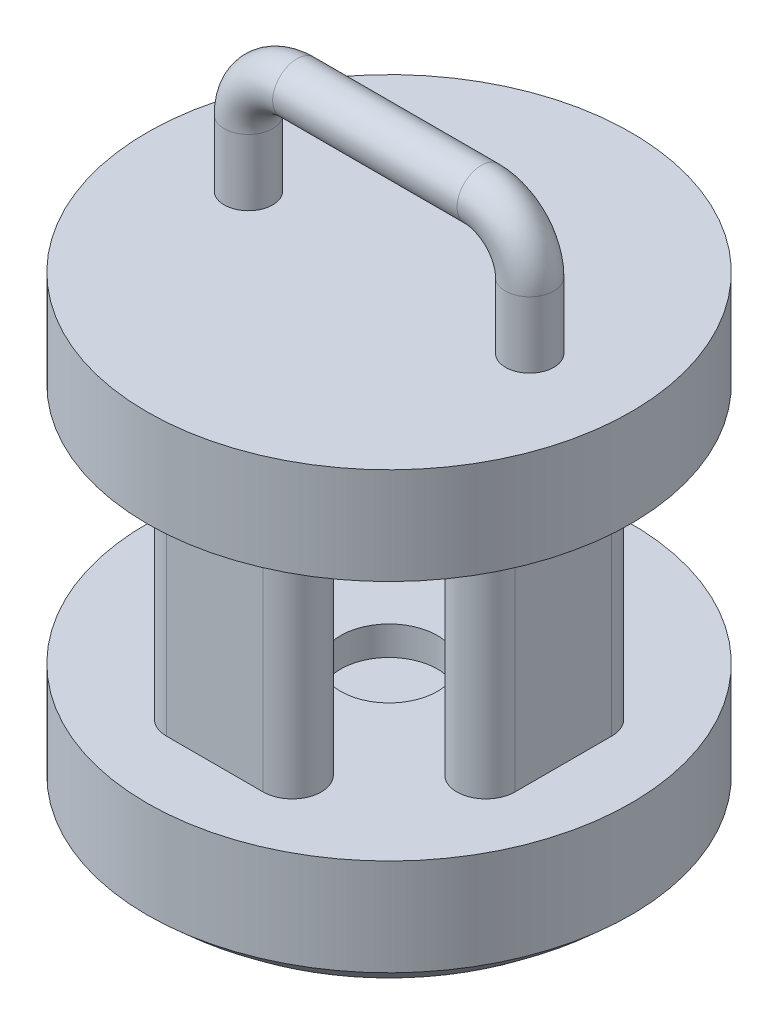
ISO-10303-21;
HEADER;
FILE_DESCRIPTION(('STEP AP214'),'2;1');
FILE_NAME('part.step','',(''),(''),'','','');
FILE_SCHEMA(('AUTOMOTIVE_DESIGN { 1 0 10303 214 1 1 1 1 }'));
ENDSEC;
DATA;
#1=APPLICATION_CONTEXT('core data for automotive mechanical design processes');
#2=APPLICATION_PROTOCOL_DEFINITION('international standard','automotive_design',2000,#1);
#3=PRODUCT_CONTEXT('',#1,'mechanical');
#4=PRODUCT('Part','Part','',(#3));
#5=PRODUCT_RELATED_PRODUCT_CATEGORY('part','',(#4));
#6=PRODUCT_DEFINITION_FORMATION('','',#4);
#7=PRODUCT_DEFINITION_CONTEXT('part definition',#1,'design');
#8=PRODUCT_DEFINITION('design','',#6,#7);
#9=PRODUCT_DEFINITION_SHAPE('','',#8);
#10=(LENGTH_UNIT() NAMED_UNIT(*) SI_UNIT(.MILLI.,.METRE.));
#11=(NAMED_UNIT(*) PLANE_ANGLE_UNIT() SI_UNIT($,.RADIAN.));
#12=(NAMED_UNIT(*) SI_UNIT($,.STERADIAN.) SOLID_ANGLE_UNIT());
#13=UNCERTAINTY_MEASURE_WITH_UNIT(LENGTH_MEASURE(1.E-05),#10,'distance_accuracy_value','');
#14=(GEOMETRIC_REPRESENTATION_CONTEXT(3) GLOBAL_UNCERTAINTY_ASSIGNED_CONTEXT((#13)) GLOBAL_UNIT_ASSIGNED_CONTEXT((#10,
#11,#12)) REPRESENTATION_CONTEXT('',''));
#15=CARTESIAN_POINT('',(0.,0.,0.));
#16=DIRECTION('',(0.,0.,1.));
#17=DIRECTION('',(1.,0.,0.));
#18=AXIS2_PLACEMENT_3D('',#15,#16,#17);
#19=CARTESIAN_POINT('',(0.,11.43,0.));
#20=DIRECTION('',(0.,1.,0.));
#21=DIRECTION('',(0.,0.,1.));
#22=AXIS2_PLACEMENT_3D('',#19,#20,#21);
#23=PLANE('',#22);
#24=CARTESIAN_POINT('',(-3.68967686671968,11.43,0.));
#25=DIRECTION('',(0.,1.,0.));
#26=DIRECTION('',(0.,0.,1.));
#27=AXIS2_PLACEMENT_3D('',#24,#25,#26);
#28=CIRCLE('',#27,0.635);
#29=CARTESIAN_POINT('',(-3.68967686671968,11.43,0.635));
#30=VERTEX_POINT('',#29);
#31=EDGE_CURVE('E11',#30,#30,#28,.T.);
#32=ORIENTED_EDGE('',*,*,#31,.F.);
#33=EDGE_LOOP('',(#32));
#34=FACE_BOUND('',#33,.T.);
#35=CARTESIAN_POINT('',(0.,11.43,0.));
#36=DIRECTION('',(0.,1.,0.));
#37=DIRECTION('',(0.,0.,1.));
#38=AXIS2_PLACEMENT_3D('',#35,#36,#37);
#39=CIRCLE('',#38,6.35);
#40=CARTESIAN_POINT('',(0.,11.43,6.35));
#41=VERTEX_POINT('',#40);
#42=EDGE_CURVE('E178',#41,#41,#39,.T.);
#43=ORIENTED_EDGE('',*,*,#42,.T.);
#44=EDGE_LOOP('',(#43));
#45=FACE_BOUND('',#44,.T.);
#46=CARTESIAN_POINT('',(3.68967686671968,11.43,0.));
#47=DIRECTION('',(0.,-1.,0.));
#48=DIRECTION('',(0.,0.,1.));
#49=AXIS2_PLACEMENT_3D('',#46,#47,#48);
#50=CIRCLE('',#49,0.635);
#51=CARTESIAN_POINT('',(3.68967686671968,11.43,0.635));
#52=VERTEX_POINT('',#51);
#53=EDGE_CURVE('E397',#52,#52,#50,.T.);
#54=ORIENTED_EDGE('',*,*,#53,.T.);
#55=EDGE_LOOP('',(#54));
#56=FACE_BOUND('',#55,.T.);
#57=ADVANCED_FACE('F33',(#34,#45,#56),#23,.T.);
#58=CARTESIAN_POINT('',(0.,2.54,0.));
#59=DIRECTION('',(0.,1.,0.));
#60=DIRECTION('',(0.,0.,1.));
#61=AXIS2_PLACEMENT_3D('',#58,#59,#60);
#62=PLANE('',#61);
#63=CARTESIAN_POINT('',(0.,2.54,0.));
#64=DIRECTION('',(0.,1.,0.));
#65=DIRECTION('',(0.,0.,1.));
#66=AXIS2_PLACEMENT_3D('',#63,#64,#65);
#67=CIRCLE('',#66,1.27);
#68=CARTESIAN_POINT('',(0.,2.54,1.27));
#69=VERTEX_POINT('',#68);
#70=EDGE_CURVE('E415',#69,#69,#67,.T.);
#71=ORIENTED_EDGE('',*,*,#70,.F.);
#72=EDGE_LOOP('',(#71));
#73=FACE_BOUND('',#72,.T.);
#74=DIRECTION('',(-1.,0.,0.));
#75=VECTOR('',#74,1.);
#76=CARTESIAN_POINT('',(1.27,2.54,-4.572));
#77=LINE('',#76,#75);
#78=CARTESIAN_POINT('',(1.27,2.54,-4.572));
#79=VERTEX_POINT('',#78);
#80=CARTESIAN_POINT('',(-1.27,2.54,-4.572));
#81=VERTEX_POINT('',#80);
#82=EDGE_CURVE('E205',#79,#81,#77,.T.);
#83=ORIENTED_EDGE('',*,*,#82,.F.);
#84=CARTESIAN_POINT('',(1.27,2.54,-3.81));
#85=DIRECTION('',(0.,1.,0.));
#86=DIRECTION('',(0.,0.,-1.));
#87=AXIS2_PLACEMENT_3D('',#84,#85,#86);
#88=CIRCLE('',#87,0.762);
#89=CARTESIAN_POINT('',(1.27,2.54,-3.048));
#90=VERTEX_POINT('',#89);
#91=EDGE_CURVE('E188',#90,#79,#88,.T.);
#92=ORIENTED_EDGE('',*,*,#91,.F.);
#93=DIRECTION('',(1.,0.,0.));
#94=VECTOR('',#93,1.);
#95=CARTESIAN_POINT('',(1.27,2.54,-3.048));
#96=LINE('',#95,#94);
#97=CARTESIAN_POINT('',(-1.27,2.54,-3.048));
#98=VERTEX_POINT('',#97);
#99=EDGE_CURVE('E193',#98,#90,#96,.T.);
#100=ORIENTED_EDGE('',*,*,#99,.F.);
#101=CARTESIAN_POINT('',(-1.27,2.54,-3.81));
#102=DIRECTION('',(0.,1.,0.));
#103=DIRECTION('',(0.,0.,-1.));
#104=AXIS2_PLACEMENT_3D('',#101,#102,#103);
#105=CIRCLE('',#104,0.762);
#106=EDGE_CURVE('E207',#81,#98,#105,.T.);
#107=ORIENTED_EDGE('',*,*,#106,.F.);
#108=EDGE_LOOP('',(#83,#92,#100,#107));
#109=FACE_BOUND('',#108,.T.);
#110=DIRECTION('',(1.,0.,0.));
#111=VECTOR('',#110,1.);
#112=CARTESIAN_POINT('',(-1.27,2.54,4.572));
#113=LINE('',#112,#111);
#114=CARTESIAN_POINT('',(-1.27,2.54,4.572));
#115=VERTEX_POINT('',#114);
#116=CARTESIAN_POINT('',(1.27,2.54,4.572));
#117=VERTEX_POINT('',#116);
#118=EDGE_CURVE('E267',#115,#117,#113,.T.);
#119=ORIENTED_EDGE('',*,*,#118,.F.);
#120=CARTESIAN_POINT('',(-1.27,2.54,3.81));
#121=DIRECTION('',(0.,1.,0.));
#122=DIRECTION('',(0.,0.,1.));
#123=AXIS2_PLACEMENT_3D('',#120,#121,#122);
#124=CIRCLE('',#123,0.762);
#125=CARTESIAN_POINT('',(-1.27,2.54,3.048));
#126=VERTEX_POINT('',#125);
#127=EDGE_CURVE('E250',#126,#115,#124,.T.);
#128=ORIENTED_EDGE('',*,*,#127,.F.);
#129=DIRECTION('',(-1.,0.,0.));
#130=VECTOR('',#129,1.);
#131=CARTESIAN_POINT('',(-1.27,2.54,3.048));
#132=LINE('',#131,#130);
#133=CARTESIAN_POINT('',(1.27,2.54,3.048));
#134=VERTEX_POINT('',#133);
#135=EDGE_CURVE('E255',#134,#126,#132,.T.);
#136=ORIENTED_EDGE('',*,*,#135,.F.);
#137=CARTESIAN_POINT('',(1.27,2.54,3.81));
#138=DIRECTION('',(0.,1.,0.));
#139=DIRECTION('',(0.,0.,1.));
#140=AXIS2_PLACEMENT_3D('',#137,#138,#139);
#141=CIRCLE('',#140,0.762);
#142=EDGE_CURVE('E269',#117,#134,#141,.T.);
#143=ORIENTED_EDGE('',*,*,#142,.F.);
#144=EDGE_LOOP('',(#119,#128,#136,#143));
#145=FACE_BOUND('',#144,.T.);
#146=CARTESIAN_POINT('',(0.,2.54,0.));
#147=DIRECTION('',(0.,1.,0.));
#148=DIRECTION('',(0.,0.,1.));
#149=AXIS2_PLACEMENT_3D('',#146,#147,#148);
#150=CIRCLE('',#149,6.35);
#151=CARTESIAN_POINT('',(0.,2.54,6.35));
#152=VERTEX_POINT('',#151);
#153=EDGE_CURVE('E42',#152,#152,#150,.T.);
#154=ORIENTED_EDGE('',*,*,#153,.T.);
#155=EDGE_LOOP('',(#154));
#156=FACE_BOUND('',#155,.T.);
#157=DIRECTION('',(0.,0.,1.));
#158=VECTOR('',#157,1.);
#159=CARTESIAN_POINT('',(-4.572,2.54,-1.27000000000002));
#160=LINE('',#159,#158);
#161=CARTESIAN_POINT('',(-4.572,2.54,-1.27000000000002));
#162=VERTEX_POINT('',#161);
#163=CARTESIAN_POINT('',(-4.572,2.54,1.26999999999998));
#164=VERTEX_POINT('',#163);
#165=EDGE_CURVE('E235',#162,#164,#160,.T.);
#166=ORIENTED_EDGE('',*,*,#165,.F.);
#167=CARTESIAN_POINT('',(-3.81,2.54,-1.27000000000001));
#168=DIRECTION('',(0.,1.,0.));
#169=DIRECTION('',(-1.,0.,0.));
#170=AXIS2_PLACEMENT_3D('',#167,#168,#169);
#171=CIRCLE('',#170,0.762);
#172=CARTESIAN_POINT('',(-3.04799999999999,2.54,-1.27000000000001));
#173=VERTEX_POINT('',#172);
#174=EDGE_CURVE('E218',#173,#162,#171,.T.);
#175=ORIENTED_EDGE('',*,*,#174,.F.);
#176=DIRECTION('',(0.,0.,-1.));
#177=VECTOR('',#176,1.);
#178=CARTESIAN_POINT('',(-3.04799999999999,2.54,-1.27000000000001));
#179=LINE('',#178,#177);
#180=CARTESIAN_POINT('',(-3.048,2.54,1.26999999999999));
#181=VERTEX_POINT('',#180);
#182=EDGE_CURVE('E223',#181,#173,#179,.T.);
#183=ORIENTED_EDGE('',*,*,#182,.F.);
#184=CARTESIAN_POINT('',(-3.81,2.54,1.26999999999999));
#185=DIRECTION('',(0.,1.,0.));
#186=DIRECTION('',(-1.,0.,0.));
#187=AXIS2_PLACEMENT_3D('',#184,#185,#186);
#188=CIRCLE('',#187,0.762);
#189=EDGE_CURVE('E237',#164,#181,#188,.T.);
#190=ORIENTED_EDGE('',*,*,#189,.F.);
#191=EDGE_LOOP('',(#166,#175,#183,#190));
#192=FACE_BOUND('',#191,.T.);
#193=DIRECTION('',(0.,0.,-1.));
#194=VECTOR('',#193,1.);
#195=CARTESIAN_POINT('',(4.57199999999999,2.54,1.27000000000005));
#196=LINE('',#195,#194);
#197=CARTESIAN_POINT('',(4.57199999999999,2.54,1.27000000000005));
#198=VERTEX_POINT('',#197);
#199=CARTESIAN_POINT('',(4.57200000000001,2.54,-1.26999999999995));
#200=VERTEX_POINT('',#199);
#201=EDGE_CURVE('E177',#198,#200,#196,.T.);
#202=ORIENTED_EDGE('',*,*,#201,.F.);
#203=CARTESIAN_POINT('',(3.80999999999999,2.54,1.27000000000004));
#204=DIRECTION('',(0.,1.,0.));
#205=DIRECTION('',(1.,0.,0.));
#206=AXIS2_PLACEMENT_3D('',#203,#204,#205);
#207=CIRCLE('',#206,0.762);
#208=CARTESIAN_POINT('',(3.04799999999999,2.54,1.27000000000003));
#209=VERTEX_POINT('',#208);
#210=EDGE_CURVE('E175',#209,#198,#207,.T.);
#211=ORIENTED_EDGE('',*,*,#210,.F.);
#212=DIRECTION('',(0.,0.,1.));
#213=VECTOR('',#212,1.);
#214=CARTESIAN_POINT('',(3.04799999999999,2.54,1.27000000000003));
#215=LINE('',#214,#213);
#216=CARTESIAN_POINT('',(3.04800000000001,2.54,-1.26999999999997));
#217=VERTEX_POINT('',#216);
#218=EDGE_CURVE('E160',#217,#209,#215,.T.);
#219=ORIENTED_EDGE('',*,*,#218,.F.);
#220=CARTESIAN_POINT('',(3.81000000000001,2.54,-1.26999999999996));
#221=DIRECTION('',(0.,1.,0.));
#222=DIRECTION('',(1.,0.,0.));
#223=AXIS2_PLACEMENT_3D('',#220,#221,#222);
#224=CIRCLE('',#223,0.762);
#225=EDGE_CURVE('E180',#200,#217,#224,.T.);
#226=ORIENTED_EDGE('',*,*,#225,.F.);
#227=EDGE_LOOP('',(#202,#211,#219,#226));
#228=FACE_BOUND('',#227,.T.);
#229=ADVANCED_FACE('F298',(#73,#109,#145,#156,#192,#228),#62,.T.);
#230=CARTESIAN_POINT('',(0.,2.54,0.));
#231=DIRECTION('',(0.,-1.,0.));
#232=DIRECTION('',(0.,0.,-1.));
#233=AXIS2_PLACEMENT_3D('',#230,#231,#232);
#234=CYLINDRICAL_SURFACE('',#233,6.35);
#235=ORIENTED_EDGE('',*,*,#153,.F.);
#236=EDGE_LOOP('',(#235));
#237=FACE_BOUND('',#236,.T.);
#238=CARTESIAN_POINT('',(0.,0.,0.));
#239=DIRECTION('',(0.,1.,0.));
#240=DIRECTION('',(0.,0.,1.));
#241=AXIS2_PLACEMENT_3D('',#238,#239,#240);
#242=CIRCLE('',#241,6.35);
#243=CARTESIAN_POINT('',(0.,0.,6.35));
#244=VERTEX_POINT('',#243);
#245=EDGE_CURVE('E37',#244,#244,#242,.T.);
#246=ORIENTED_EDGE('',*,*,#245,.T.);
#247=EDGE_LOOP('',(#246));
#248=FACE_BOUND('',#247,.T.);
#249=ADVANCED_FACE('F287',(#237,#248),#234,.T.);
#250=CARTESIAN_POINT('',(0.,6.66749999999999,0.));
#251=DIRECTION('',(0.,0.,1.));
#252=DIRECTION('',(1.,0.,0.));
#253=AXIS2_PLACEMENT_3D('',#250,#251,#252);
#254=SPHERICAL_SURFACE('',#253,9.2075);
#255=CARTESIAN_POINT('',(0.,6.66749999999999,0.));
#256=DIRECTION('',(0.,1.,0.));
#257=DIRECTION('',(0.,0.,1.));
#258=AXIS2_PLACEMENT_3D('',#255,#256,#257);
#259=SPHERICAL_SURFACE('',#258,9.2075);
#260=ORIENTED_EDGE('',*,*,#245,.F.);
#261=EDGE_LOOP('',(#260));
#262=FACE_BOUND('',#261,.T.);
#263=ADVANCED_FACE('F35',(#262),#259,.T.);
#264=CARTESIAN_POINT('',(-1.27,8.89,3.81));
#265=DIRECTION('',(0.,-1.,0.));
#266=DIRECTION('',(0.,0.,-1.));
#267=AXIS2_PLACEMENT_3D('',#264,#265,#266);
#268=CYLINDRICAL_SURFACE('',#267,0.762);
#269=ORIENTED_EDGE('',*,*,#127,.T.);
#270=DIRECTION('',(0.,-1.,0.));
#271=VECTOR('',#270,1.);
#272=CARTESIAN_POINT('',(-1.27,8.89,4.572));
#273=LINE('',#272,#271);
#274=CARTESIAN_POINT('',(-1.27,8.89,4.572));
#275=VERTEX_POINT('',#274);
#276=EDGE_CURVE('E280',#275,#115,#273,.T.);
#277=ORIENTED_EDGE('',*,*,#276,.F.);
#278=CARTESIAN_POINT('',(-1.27,8.89,3.81));
#279=DIRECTION('',(0.,1.,0.));
#280=DIRECTION('',(0.,0.,1.));
#281=AXIS2_PLACEMENT_3D('',#278,#279,#280);
#282=CIRCLE('',#281,0.762);
#283=CARTESIAN_POINT('',(-1.27,8.89,3.048));
#284=VERTEX_POINT('',#283);
#285=EDGE_CURVE('E251',#284,#275,#282,.T.);
#286=ORIENTED_EDGE('',*,*,#285,.F.);
#287=DIRECTION('',(0.,-1.,0.));
#288=VECTOR('',#287,1.);
#289=CARTESIAN_POINT('',(-1.27,8.89,3.048));
#290=LINE('',#289,#288);
#291=EDGE_CURVE('E264',#284,#126,#290,.T.);
#292=ORIENTED_EDGE('',*,*,#291,.T.);
#293=EDGE_LOOP('',(#269,#277,#286,#292));
#294=FACE_BOUND('',#293,.T.);
#295=ADVANCED_FACE('F290',(#294),#268,.T.);
#296=CARTESIAN_POINT('',(-1.27,8.89,4.572));
#297=DIRECTION('',(0.,0.,-1.));
#298=DIRECTION('',(-1.,0.,0.));
#299=AXIS2_PLACEMENT_3D('',#296,#297,#298);
#300=PLANE('',#299);
#301=ORIENTED_EDGE('',*,*,#118,.T.);
#302=DIRECTION('',(0.,-1.,0.));
#303=VECTOR('',#302,1.);
#304=CARTESIAN_POINT('',(1.27,8.89,4.572));
#305=LINE('',#304,#303);
#306=CARTESIAN_POINT('',(1.27,8.89,4.572));
#307=VERTEX_POINT('',#306);
#308=EDGE_CURVE('E277',#307,#117,#305,.T.);
#309=ORIENTED_EDGE('',*,*,#308,.F.);
#310=DIRECTION('',(1.,0.,0.));
#311=VECTOR('',#310,1.);
#312=CARTESIAN_POINT('',(-1.27,8.89,4.572));
#313=LINE('',#312,#311);
#314=EDGE_CURVE('E254',#275,#307,#313,.T.);
#315=ORIENTED_EDGE('',*,*,#314,.F.);
#316=ORIENTED_EDGE('',*,*,#276,.T.);
#317=EDGE_LOOP('',(#301,#309,#315,#316));
#318=FACE_BOUND('',#317,.T.);
#319=ADVANCED_FACE('F295',(#318),#300,.F.);
#320=CARTESIAN_POINT('',(1.27,8.89,3.81));
#321=DIRECTION('',(0.,-1.,0.));
#322=DIRECTION('',(0.,0.,-1.));
#323=AXIS2_PLACEMENT_3D('',#320,#321,#322);
#324=CYLINDRICAL_SURFACE('',#323,0.762);
#325=ORIENTED_EDGE('',*,*,#142,.T.);
#326=DIRECTION('',(0.,-1.,0.));
#327=VECTOR('',#326,1.);
#328=CARTESIAN_POINT('',(1.27,8.89,3.048));
#329=LINE('',#328,#327);
#330=CARTESIAN_POINT('',(1.27,8.89,3.048));
#331=VERTEX_POINT('',#330);
#332=EDGE_CURVE('E275',#331,#134,#329,.T.);
#333=ORIENTED_EDGE('',*,*,#332,.F.);
#334=CARTESIAN_POINT('',(1.27,8.89,3.81));
#335=DIRECTION('',(0.,1.,0.));
#336=DIRECTION('',(0.,0.,1.));
#337=AXIS2_PLACEMENT_3D('',#334,#335,#336);
#338=CIRCLE('',#337,0.762);
#339=EDGE_CURVE('E258',#307,#331,#338,.T.);
#340=ORIENTED_EDGE('',*,*,#339,.F.);
#341=ORIENTED_EDGE('',*,*,#308,.T.);
#342=EDGE_LOOP('',(#325,#333,#340,#341));
#343=FACE_BOUND('',#342,.T.);
#344=ADVANCED_FACE('F367',(#343),#324,.T.);
#345=CARTESIAN_POINT('',(-1.27,8.89,3.048));
#346=DIRECTION('',(0.,0.,1.));
#347=DIRECTION('',(1.,0.,0.));
#348=AXIS2_PLACEMENT_3D('',#345,#346,#347);
#349=PLANE('',#348);
#350=ORIENTED_EDGE('',*,*,#135,.T.);
#351=ORIENTED_EDGE('',*,*,#291,.F.);
#352=DIRECTION('',(-1.,0.,0.));
#353=VECTOR('',#352,1.);
#354=CARTESIAN_POINT('',(-1.27,8.89,3.048));
#355=LINE('',#354,#353);
#356=EDGE_CURVE('E261',#331,#284,#355,.T.);
#357=ORIENTED_EDGE('',*,*,#356,.F.);
#358=ORIENTED_EDGE('',*,*,#332,.T.);
#359=EDGE_LOOP('',(#350,#351,#357,#358));
#360=FACE_BOUND('',#359,.T.);
#361=ADVANCED_FACE('F363',(#360),#349,.F.);
#362=CARTESIAN_POINT('',(-3.81,8.89,-1.27000000000001));
#363=DIRECTION('',(0.,-1.,0.));
#364=DIRECTION('',(0.,0.,-1.));
#365=AXIS2_PLACEMENT_3D('',#362,#363,#364);
#366=CYLINDRICAL_SURFACE('',#365,0.762);
#367=ORIENTED_EDGE('',*,*,#174,.T.);
#368=DIRECTION('',(0.,-1.,0.));
#369=VECTOR('',#368,1.);
#370=CARTESIAN_POINT('',(-4.572,8.89,-1.27000000000002));
#371=LINE('',#370,#369);
#372=CARTESIAN_POINT('',(-4.572,8.89,-1.27000000000002));
#373=VERTEX_POINT('',#372);
#374=EDGE_CURVE('E248',#373,#162,#371,.T.);
#375=ORIENTED_EDGE('',*,*,#374,.F.);
#376=CARTESIAN_POINT('',(-3.81,8.89,-1.27000000000001));
#377=DIRECTION('',(0.,1.,0.));
#378=DIRECTION('',(-1.,0.,0.));
#379=AXIS2_PLACEMENT_3D('',#376,#377,#378);
#380=CIRCLE('',#379,0.762);
#381=CARTESIAN_POINT('',(-3.04799999999999,8.89,-1.27000000000001));
#382=VERTEX_POINT('',#381);
#383=EDGE_CURVE('E219',#382,#373,#380,.T.);
#384=ORIENTED_EDGE('',*,*,#383,.F.);
#385=DIRECTION('',(0.,-1.,0.));
#386=VECTOR('',#385,1.);
#387=CARTESIAN_POINT('',(-3.04799999999999,8.89,-1.27000000000001));
#388=LINE('',#387,#386);
#389=EDGE_CURVE('E232',#382,#173,#388,.T.);
#390=ORIENTED_EDGE('',*,*,#389,.T.);
#391=EDGE_LOOP('',(#367,#375,#384,#390));
#392=FACE_BOUND('',#391,.T.);
#393=ADVANCED_FACE('F359',(#392),#366,.T.);
#394=CARTESIAN_POINT('',(-4.572,8.89,-1.27000000000002));
#395=DIRECTION('',(1.,0.,0.));
#396=DIRECTION('',(0.,0.,-1.));
#397=AXIS2_PLACEMENT_3D('',#394,#395,#396);
#398=PLANE('',#397);
#399=ORIENTED_EDGE('',*,*,#165,.T.);
#400=DIRECTION('',(0.,-1.,0.));
#401=VECTOR('',#400,1.);
#402=CARTESIAN_POINT('',(-4.572,8.89,1.26999999999998));
#403=LINE('',#402,#401);
#404=CARTESIAN_POINT('',(-4.572,8.89,1.26999999999998));
#405=VERTEX_POINT('',#404);
#406=EDGE_CURVE('E245',#405,#164,#403,.T.);
#407=ORIENTED_EDGE('',*,*,#406,.F.);
#408=DIRECTION('',(0.,0.,1.));
#409=VECTOR('',#408,1.);
#410=CARTESIAN_POINT('',(-4.572,8.89,-1.27000000000002));
#411=LINE('',#410,#409);
#412=EDGE_CURVE('E222',#373,#405,#411,.T.);
#413=ORIENTED_EDGE('',*,*,#412,.F.);
#414=ORIENTED_EDGE('',*,*,#374,.T.);
#415=EDGE_LOOP('',(#399,#407,#413,#414));
#416=FACE_BOUND('',#415,.T.);
#417=ADVANCED_FACE('F355',(#416),#398,.F.);
#418=CARTESIAN_POINT('',(-3.81,8.89,1.26999999999999));
#419=DIRECTION('',(0.,-1.,0.));
#420=DIRECTION('',(0.,0.,-1.));
#421=AXIS2_PLACEMENT_3D('',#418,#419,#420);
#422=CYLINDRICAL_SURFACE('',#421,0.762);
#423=ORIENTED_EDGE('',*,*,#189,.T.);
#424=DIRECTION('',(0.,-1.,0.));
#425=VECTOR('',#424,1.);
#426=CARTESIAN_POINT('',(-3.048,8.89,1.26999999999999));
#427=LINE('',#426,#425);
#428=CARTESIAN_POINT('',(-3.048,8.89,1.26999999999999));
#429=VERTEX_POINT('',#428);
#430=EDGE_CURVE('E243',#429,#181,#427,.T.);
#431=ORIENTED_EDGE('',*,*,#430,.F.);
#432=CARTESIAN_POINT('',(-3.81,8.89,1.26999999999999));
#433=DIRECTION('',(0.,1.,0.));
#434=DIRECTION('',(-1.,0.,0.));
#435=AXIS2_PLACEMENT_3D('',#432,#433,#434);
#436=CIRCLE('',#435,0.762);
#437=EDGE_CURVE('E226',#405,#429,#436,.T.);
#438=ORIENTED_EDGE('',*,*,#437,.F.);
#439=ORIENTED_EDGE('',*,*,#406,.T.);
#440=EDGE_LOOP('',(#423,#431,#438,#439));
#441=FACE_BOUND('',#440,.T.);
#442=ADVANCED_FACE('F351',(#441),#422,.T.);
#443=CARTESIAN_POINT('',(-3.04799999999999,8.89,-1.27000000000001));
#444=DIRECTION('',(-1.,0.,0.));
#445=DIRECTION('',(0.,0.,1.));
#446=AXIS2_PLACEMENT_3D('',#443,#444,#445);
#447=PLANE('',#446);
#448=ORIENTED_EDGE('',*,*,#182,.T.);
#449=ORIENTED_EDGE('',*,*,#389,.F.);
#450=DIRECTION('',(0.,0.,-1.));
#451=VECTOR('',#450,1.);
#452=CARTESIAN_POINT('',(-3.04799999999999,8.89,-1.27000000000001));
#453=LINE('',#452,#451);
#454=EDGE_CURVE('E229',#429,#382,#453,.T.);
#455=ORIENTED_EDGE('',*,*,#454,.F.);
#456=ORIENTED_EDGE('',*,*,#430,.T.);
#457=EDGE_LOOP('',(#448,#449,#455,#456));
#458=FACE_BOUND('',#457,.T.);
#459=ADVANCED_FACE('F347',(#458),#447,.F.);
#460=CARTESIAN_POINT('',(1.27,8.89,-3.81));
#461=DIRECTION('',(0.,-1.,0.));
#462=DIRECTION('',(0.,0.,-1.));
#463=AXIS2_PLACEMENT_3D('',#460,#461,#462);
#464=CYLINDRICAL_SURFACE('',#463,0.762);
#465=ORIENTED_EDGE('',*,*,#91,.T.);
#466=DIRECTION('',(0.,-1.,0.));
#467=VECTOR('',#466,1.);
#468=CARTESIAN_POINT('',(1.27,8.89,-4.572));
#469=LINE('',#468,#467);
#470=CARTESIAN_POINT('',(1.27,8.89,-4.572));
#471=VERTEX_POINT('',#470);
#472=EDGE_CURVE('E216',#471,#79,#469,.T.);
#473=ORIENTED_EDGE('',*,*,#472,.F.);
#474=CARTESIAN_POINT('',(1.27,8.89,-3.81));
#475=DIRECTION('',(0.,1.,0.));
#476=DIRECTION('',(0.,0.,-1.));
#477=AXIS2_PLACEMENT_3D('',#474,#475,#476);
#478=CIRCLE('',#477,0.762);
#479=CARTESIAN_POINT('',(1.27,8.89,-3.048));
#480=VERTEX_POINT('',#479);
#481=EDGE_CURVE('E189',#480,#471,#478,.T.);
#482=ORIENTED_EDGE('',*,*,#481,.F.);
#483=DIRECTION('',(0.,-1.,0.));
#484=VECTOR('',#483,1.);
#485=CARTESIAN_POINT('',(1.27,8.89,-3.048));
#486=LINE('',#485,#484);
#487=EDGE_CURVE('E202',#480,#90,#486,.T.);
#488=ORIENTED_EDGE('',*,*,#487,.T.);
#489=EDGE_LOOP('',(#465,#473,#482,#488));
#490=FACE_BOUND('',#489,.T.);
#491=ADVANCED_FACE('F343',(#490),#464,.T.);
#492=CARTESIAN_POINT('',(1.27,8.89,-4.572));
#493=DIRECTION('',(0.,0.,1.));
#494=DIRECTION('',(1.,0.,0.));
#495=AXIS2_PLACEMENT_3D('',#492,#493,#494);
#496=PLANE('',#495);
#497=ORIENTED_EDGE('',*,*,#82,.T.);
#498=DIRECTION('',(0.,-1.,0.));
#499=VECTOR('',#498,1.);
#500=CARTESIAN_POINT('',(-1.27,8.89,-4.572));
#501=LINE('',#500,#499);
#502=CARTESIAN_POINT('',(-1.27,8.89,-4.572));
#503=VERTEX_POINT('',#502);
#504=EDGE_CURVE('E213',#503,#81,#501,.T.);
#505=ORIENTED_EDGE('',*,*,#504,.F.);
#506=DIRECTION('',(-1.,0.,0.));
#507=VECTOR('',#506,1.);
#508=CARTESIAN_POINT('',(1.27,8.89,-4.572));
#509=LINE('',#508,#507);
#510=EDGE_CURVE('E192',#471,#503,#509,.T.);
#511=ORIENTED_EDGE('',*,*,#510,.F.);
#512=ORIENTED_EDGE('',*,*,#472,.T.);
#513=EDGE_LOOP('',(#497,#505,#511,#512));
#514=FACE_BOUND('',#513,.T.);
#515=ADVANCED_FACE('F339',(#514),#496,.F.);
#516=CARTESIAN_POINT('',(-1.27,8.89,-3.81));
#517=DIRECTION('',(0.,-1.,0.));
#518=DIRECTION('',(0.,0.,-1.));
#519=AXIS2_PLACEMENT_3D('',#516,#517,#518);
#520=CYLINDRICAL_SURFACE('',#519,0.762);
#521=ORIENTED_EDGE('',*,*,#106,.T.);
#522=DIRECTION('',(0.,-1.,0.));
#523=VECTOR('',#522,1.);
#524=CARTESIAN_POINT('',(-1.27,8.89,-3.048));
#525=LINE('',#524,#523);
#526=CARTESIAN_POINT('',(-1.27,8.89,-3.048));
#527=VERTEX_POINT('',#526);
#528=EDGE_CURVE('E58',#527,#98,#525,.T.);
#529=ORIENTED_EDGE('',*,*,#528,.F.);
#530=CARTESIAN_POINT('',(-1.27,8.89,-3.81));
#531=DIRECTION('',(0.,1.,0.));
#532=DIRECTION('',(0.,0.,-1.));
#533=AXIS2_PLACEMENT_3D('',#530,#531,#532);
#534=CIRCLE('',#533,0.762);
#535=EDGE_CURVE('E196',#503,#527,#534,.T.);
#536=ORIENTED_EDGE('',*,*,#535,.F.);
#537=ORIENTED_EDGE('',*,*,#504,.T.);
#538=EDGE_LOOP('',(#521,#529,#536,#537));
#539=FACE_BOUND('',#538,.T.);
#540=ADVANCED_FACE('F336',(#539),#520,.T.);
#541=CARTESIAN_POINT('',(1.27,8.89,-3.048));
#542=DIRECTION('',(0.,0.,-1.));
#543=DIRECTION('',(-1.,0.,0.));
#544=AXIS2_PLACEMENT_3D('',#541,#542,#543);
#545=PLANE('',#544);
#546=ORIENTED_EDGE('',*,*,#99,.T.);
#547=ORIENTED_EDGE('',*,*,#487,.F.);
#548=DIRECTION('',(1.,0.,0.));
#549=VECTOR('',#548,1.);
#550=CARTESIAN_POINT('',(1.27,8.89,-3.048));
#551=LINE('',#550,#549);
#552=EDGE_CURVE('E199',#527,#480,#551,.T.);
#553=ORIENTED_EDGE('',*,*,#552,.F.);
#554=ORIENTED_EDGE('',*,*,#528,.T.);
#555=EDGE_LOOP('',(#546,#547,#553,#554));
#556=FACE_BOUND('',#555,.T.);
#557=ADVANCED_FACE('F333',(#556),#545,.F.);
#558=CARTESIAN_POINT('',(3.80999999999999,8.89,1.27000000000004));
#559=DIRECTION('',(0.,-1.,0.));
#560=DIRECTION('',(0.,0.,-1.));
#561=AXIS2_PLACEMENT_3D('',#558,#559,#560);
#562=CYLINDRICAL_SURFACE('',#561,0.762);
#563=ORIENTED_EDGE('',*,*,#210,.T.);
#564=DIRECTION('',(0.,-1.,0.));
#565=VECTOR('',#564,1.);
#566=CARTESIAN_POINT('',(4.57199999999999,8.89,1.27000000000005));
#567=LINE('',#566,#565);
#568=CARTESIAN_POINT('',(4.57199999999999,8.89,1.27000000000005));
#569=VERTEX_POINT('',#568);
#570=EDGE_CURVE('E155',#569,#198,#567,.T.);
#571=ORIENTED_EDGE('',*,*,#570,.F.);
#572=CARTESIAN_POINT('',(3.80999999999999,8.89,1.27000000000004));
#573=DIRECTION('',(0.,1.,0.));
#574=DIRECTION('',(1.,0.,0.));
#575=AXIS2_PLACEMENT_3D('',#572,#573,#574);
#576=CIRCLE('',#575,0.762);
#577=CARTESIAN_POINT('',(3.04799999999999,8.89,1.27000000000003));
#578=VERTEX_POINT('',#577);
#579=EDGE_CURVE('E149',#578,#569,#576,.T.);
#580=ORIENTED_EDGE('',*,*,#579,.F.);
#581=DIRECTION('',(0.,-1.,0.));
#582=VECTOR('',#581,1.);
#583=CARTESIAN_POINT('',(3.04799999999999,8.89,1.27000000000003));
#584=LINE('',#583,#582);
#585=EDGE_CURVE('E153',#578,#209,#584,.T.);
#586=ORIENTED_EDGE('',*,*,#585,.T.);
#587=EDGE_LOOP('',(#563,#571,#580,#586));
#588=FACE_BOUND('',#587,.T.);
#589=ADVANCED_FACE('F152',(#588),#562,.T.);
#590=CARTESIAN_POINT('',(4.57199999999999,8.89,1.27000000000005));
#591=DIRECTION('',(-1.,0.,0.));
#592=DIRECTION('',(0.,0.,1.));
#593=AXIS2_PLACEMENT_3D('',#590,#591,#592);
#594=PLANE('',#593);
#595=ORIENTED_EDGE('',*,*,#201,.T.);
#596=DIRECTION('',(0.,-1.,0.));
#597=VECTOR('',#596,1.);
#598=CARTESIAN_POINT('',(4.57200000000001,8.89,-1.26999999999995));
#599=LINE('',#598,#597);
#600=CARTESIAN_POINT('',(4.57200000000001,8.89,-1.26999999999995));
#601=VERTEX_POINT('',#600);
#602=EDGE_CURVE('E184',#601,#200,#599,.T.);
#603=ORIENTED_EDGE('',*,*,#602,.F.);
#604=DIRECTION('',(0.,0.,-1.));
#605=VECTOR('',#604,1.);
#606=CARTESIAN_POINT('',(4.57199999999999,8.89,1.27000000000005));
#607=LINE('',#606,#605);
#608=EDGE_CURVE('E159',#569,#601,#607,.T.);
#609=ORIENTED_EDGE('',*,*,#608,.F.);
#610=ORIENTED_EDGE('',*,*,#570,.T.);
#611=EDGE_LOOP('',(#595,#603,#609,#610));
#612=FACE_BOUND('',#611,.T.);
#613=ADVANCED_FACE('F326',(#612),#594,.F.);
#614=CARTESIAN_POINT('',(3.81000000000001,8.89,-1.26999999999996));
#615=DIRECTION('',(0.,-1.,0.));
#616=DIRECTION('',(0.,0.,-1.));
#617=AXIS2_PLACEMENT_3D('',#614,#615,#616);
#618=CYLINDRICAL_SURFACE('',#617,0.762);
#619=ORIENTED_EDGE('',*,*,#225,.T.);
#620=DIRECTION('',(0.,-1.,0.));
#621=VECTOR('',#620,1.);
#622=CARTESIAN_POINT('',(3.04800000000001,8.89,-1.26999999999997));
#623=LINE('',#622,#621);
#624=CARTESIAN_POINT('',(3.04800000000001,8.89,-1.26999999999997));
#625=VERTEX_POINT('',#624);
#626=EDGE_CURVE('E50',#625,#217,#623,.T.);
#627=ORIENTED_EDGE('',*,*,#626,.F.);
#628=CARTESIAN_POINT('',(3.81000000000001,8.89,-1.26999999999996));
#629=DIRECTION('',(0.,1.,0.));
#630=DIRECTION('',(1.,0.,0.));
#631=AXIS2_PLACEMENT_3D('',#628,#629,#630);
#632=CIRCLE('',#631,0.762);
#633=EDGE_CURVE('E170',#601,#625,#632,.T.);
#634=ORIENTED_EDGE('',*,*,#633,.F.);
#635=ORIENTED_EDGE('',*,*,#602,.T.);
#636=EDGE_LOOP('',(#619,#627,#634,#635));
#637=FACE_BOUND('',#636,.T.);
#638=ADVANCED_FACE('F323',(#637),#618,.T.);
#639=CARTESIAN_POINT('',(3.04799999999999,8.89,1.27000000000003));
#640=DIRECTION('',(1.,0.,0.));
#641=DIRECTION('',(0.,0.,-1.));
#642=AXIS2_PLACEMENT_3D('',#639,#640,#641);
#643=PLANE('',#642);
#644=ORIENTED_EDGE('',*,*,#218,.T.);
#645=ORIENTED_EDGE('',*,*,#585,.F.);
#646=DIRECTION('',(0.,0.,1.));
#647=VECTOR('',#646,1.);
#648=CARTESIAN_POINT('',(3.04799999999999,8.89,1.27000000000003));
#649=LINE('',#648,#647);
#650=EDGE_CURVE('E163',#625,#578,#649,.T.);
#651=ORIENTED_EDGE('',*,*,#650,.F.);
#652=ORIENTED_EDGE('',*,*,#626,.T.);
#653=EDGE_LOOP('',(#644,#645,#651,#652));
#654=FACE_BOUND('',#653,.T.);
#655=ADVANCED_FACE('F162',(#654),#643,.F.);
#656=CARTESIAN_POINT('',(0.,8.89,0.));
#657=DIRECTION('',(0.,1.,0.));
#658=DIRECTION('',(0.,0.,1.));
#659=AXIS2_PLACEMENT_3D('',#656,#657,#658);
#660=PLANE('',#659);
#661=ORIENTED_EDGE('',*,*,#454,.T.);
#662=ORIENTED_EDGE('',*,*,#383,.T.);
#663=ORIENTED_EDGE('',*,*,#412,.T.);
#664=ORIENTED_EDGE('',*,*,#437,.T.);
#665=EDGE_LOOP('',(#661,#662,#663,#664));
#666=FACE_BOUND('',#665,.T.);
#667=ORIENTED_EDGE('',*,*,#650,.T.);
#668=ORIENTED_EDGE('',*,*,#579,.T.);
#669=ORIENTED_EDGE('',*,*,#608,.T.);
#670=ORIENTED_EDGE('',*,*,#633,.T.);
#671=EDGE_LOOP('',(#667,#668,#669,#670));
#672=FACE_BOUND('',#671,.T.);
#673=CARTESIAN_POINT('',(0.,8.89,0.));
#674=DIRECTION('',(0.,1.,0.));
#675=DIRECTION('',(0.,0.,1.));
#676=AXIS2_PLACEMENT_3D('',#673,#674,#675);
#677=CIRCLE('',#676,6.35);
#678=CARTESIAN_POINT('',(0.,8.89,6.35));
#679=VERTEX_POINT('',#678);
#680=EDGE_CURVE('E394',#679,#679,#677,.T.);
#681=ORIENTED_EDGE('',*,*,#680,.F.);
#682=EDGE_LOOP('',(#681));
#683=FACE_BOUND('',#682,.T.);
#684=ORIENTED_EDGE('',*,*,#552,.T.);
#685=ORIENTED_EDGE('',*,*,#481,.T.);
#686=ORIENTED_EDGE('',*,*,#510,.T.);
#687=ORIENTED_EDGE('',*,*,#535,.T.);
#688=EDGE_LOOP('',(#684,#685,#686,#687));
#689=FACE_BOUND('',#688,.T.);
#690=ORIENTED_EDGE('',*,*,#356,.T.);
#691=ORIENTED_EDGE('',*,*,#285,.T.);
#692=ORIENTED_EDGE('',*,*,#314,.T.);
#693=ORIENTED_EDGE('',*,*,#339,.T.);
#694=EDGE_LOOP('',(#690,#691,#692,#693));
#695=FACE_BOUND('',#694,.T.);
#696=ADVANCED_FACE('F167',(#666,#672,#683,#689,#695),#660,.F.);
#697=CARTESIAN_POINT('',(0.,11.43,0.));
#698=DIRECTION('',(0.,-1.,0.));
#699=DIRECTION('',(0.,0.,-1.));
#700=AXIS2_PLACEMENT_3D('',#697,#698,#699);
#701=CYLINDRICAL_SURFACE('',#700,6.35);
#702=ORIENTED_EDGE('',*,*,#42,.F.);
#703=EDGE_LOOP('',(#702));
#704=FACE_BOUND('',#703,.T.);
#705=ORIENTED_EDGE('',*,*,#680,.T.);
#706=EDGE_LOOP('',(#705));
#707=FACE_BOUND('',#706,.T.);
#708=ADVANCED_FACE('F316',(#704,#707),#701,.T.);
#709=CARTESIAN_POINT('',(3.68967686671968,13.1638179487042,0.));
#710=DIRECTION('',(0.,-1.,0.));
#711=DIRECTION('',(0.,0.,-1.));
#712=AXIS2_PLACEMENT_3D('',#709,#710,#711);
#713=CYLINDRICAL_SURFACE('',#712,0.635);
#714=CARTESIAN_POINT('',(3.68967686671968,13.1638179487042,0.));
#715=DIRECTION('',(0.,-1.,0.));
#716=DIRECTION('',(0.,0.,1.));
#717=AXIS2_PLACEMENT_3D('',#714,#715,#716);
#718=CIRCLE('',#717,0.635);
#719=CARTESIAN_POINT('',(4.32467686671968,13.1638179487042,0.));
#720=VERTEX_POINT('',#719);
#721=EDGE_CURVE('E402',#720,#720,#718,.T.);
#722=ORIENTED_EDGE('',*,*,#721,.T.);
#723=EDGE_LOOP('',(#722));
#724=FACE_BOUND('',#723,.T.);
#725=ORIENTED_EDGE('',*,*,#53,.F.);
#726=EDGE_LOOP('',(#725));
#727=FACE_BOUND('',#726,.T.);
#728=ADVANCED_FACE('F312',(#724,#727),#713,.T.);
#729=CARTESIAN_POINT('',(2.41967686671968,13.1638179487042,0.));
#730=DIRECTION('',(0.,0.,-1.));
#731=DIRECTION('',(-1.,0.,0.));
#732=AXIS2_PLACEMENT_3D('',#729,#730,#731);
#733=TOROIDAL_SURFACE('',#732,1.27,0.635);
#734=CARTESIAN_POINT('',(2.41967686671967,14.4338179487042,0.));
#735=DIRECTION('',(1.,0.,0.));
#736=DIRECTION('',(0.,0.,1.));
#737=AXIS2_PLACEMENT_3D('',#734,#735,#736);
#738=CIRCLE('',#737,0.635);
#739=CARTESIAN_POINT('',(2.41967686671967,15.0688179487042,0.));
#740=VERTEX_POINT('',#739);
#741=EDGE_CURVE('E405',#740,#740,#738,.T.);
#742=CARTESIAN_POINT('',(2.41967686671968,13.1638179487042,0.));
#743=DIRECTION('',(0.,0.,-1.));
#744=DIRECTION('',(-1.,0.,0.));
#745=AXIS2_PLACEMENT_3D('',#742,#743,#744);
#746=CIRCLE('',#745,1.905);
#747=EDGE_CURVE('',#740,#720,#746,.T.);
#748=ORIENTED_EDGE('',*,*,#741,.T.);
#749=ORIENTED_EDGE('',*,*,#721,.F.);
#750=ORIENTED_EDGE('',*,*,#747,.T.);
#751=ORIENTED_EDGE('',*,*,#747,.F.);
#752=EDGE_LOOP('',(#748,#750,#749,#751));
#753=FACE_BOUND('',#752,.T.);
#754=ADVANCED_FACE('F452',(#753),#733,.T.);
#755=CARTESIAN_POINT('',(-2.41967686671967,14.4338179487042,0.));
#756=DIRECTION('',(1.,0.,0.));
#757=DIRECTION('',(0.,0.,-1.));
#758=AXIS2_PLACEMENT_3D('',#755,#756,#757);
#759=CYLINDRICAL_SURFACE('',#758,0.635);
#760=CARTESIAN_POINT('',(-2.41967686671967,14.4338179487042,0.));
#761=DIRECTION('',(1.,0.,0.));
#762=DIRECTION('',(0.,0.,1.));
#763=AXIS2_PLACEMENT_3D('',#760,#761,#762);
#764=CIRCLE('',#763,0.635);
#765=CARTESIAN_POINT('',(-2.41967686671967,15.0688179487042,0.));
#766=VERTEX_POINT('',#765);
#767=EDGE_CURVE('E408',#766,#766,#764,.T.);
#768=ORIENTED_EDGE('',*,*,#767,.T.);
#769=EDGE_LOOP('',(#768));
#770=FACE_BOUND('',#769,.T.);
#771=ORIENTED_EDGE('',*,*,#741,.F.);
#772=EDGE_LOOP('',(#771));
#773=FACE_BOUND('',#772,.T.);
#774=ADVANCED_FACE('F449',(#770,#773),#759,.T.);
#775=CARTESIAN_POINT('',(-2.41967686671968,13.1638179487042,0.));
#776=DIRECTION('',(0.,0.,-1.));
#777=DIRECTION('',(-1.,0.,0.));
#778=AXIS2_PLACEMENT_3D('',#775,#776,#777);
#779=TOROIDAL_SURFACE('',#778,1.27,0.635);
#780=CARTESIAN_POINT('',(-3.68967686671968,13.1638179487042,0.));
#781=DIRECTION('',(0.,1.,0.));
#782=DIRECTION('',(0.,0.,1.));
#783=AXIS2_PLACEMENT_3D('',#780,#781,#782);
#784=CIRCLE('',#783,0.635);
#785=CARTESIAN_POINT('',(-4.32467686671968,13.1638179487042,0.));
#786=VERTEX_POINT('',#785);
#787=EDGE_CURVE('E410',#786,#786,#784,.T.);
#788=CARTESIAN_POINT('',(-2.41967686671968,13.1638179487042,0.));
#789=DIRECTION('',(0.,0.,-1.));
#790=DIRECTION('',(-1.,0.,0.));
#791=AXIS2_PLACEMENT_3D('',#788,#789,#790);
#792=CIRCLE('',#791,1.905);
#793=EDGE_CURVE('',#786,#766,#792,.T.);
#794=ORIENTED_EDGE('',*,*,#787,.T.);
#795=ORIENTED_EDGE('',*,*,#767,.F.);
#796=ORIENTED_EDGE('',*,*,#793,.T.);
#797=ORIENTED_EDGE('',*,*,#793,.F.);
#798=EDGE_LOOP('',(#794,#796,#795,#797));
#799=FACE_BOUND('',#798,.T.);
#800=ADVANCED_FACE('F443',(#799),#779,.T.);
#801=CARTESIAN_POINT('',(-3.68967686671968,13.1638179487042,0.));
#802=DIRECTION('',(0.,-1.,0.));
#803=DIRECTION('',(0.,0.,-1.));
#804=AXIS2_PLACEMENT_3D('',#801,#802,#803);
#805=CYLINDRICAL_SURFACE('',#804,0.635);
#806=ORIENTED_EDGE('',*,*,#787,.F.);
#807=EDGE_LOOP('',(#806));
#808=FACE_BOUND('',#807,.T.);
#809=ORIENTED_EDGE('',*,*,#31,.T.);
#810=EDGE_LOOP('',(#809));
#811=FACE_BOUND('',#810,.T.);
#812=ADVANCED_FACE('F426',(#808,#811),#805,.T.);
#813=CARTESIAN_POINT('',(0.,1.778,0.));
#814=DIRECTION('',(0.,1.,0.));
#815=DIRECTION('',(0.,0.,1.));
#816=AXIS2_PLACEMENT_3D('',#813,#814,#815);
#817=CYLINDRICAL_SURFACE('',#816,1.27);
#818=CARTESIAN_POINT('',(0.,1.778,0.));
#819=DIRECTION('',(0.,1.,0.));
#820=DIRECTION('',(0.,0.,1.));
#821=AXIS2_PLACEMENT_3D('',#818,#819,#820);
#822=CIRCLE('',#821,1.27);
#823=CARTESIAN_POINT('',(0.,1.778,1.27));
#824=VERTEX_POINT('',#823);
#825=EDGE_CURVE('E414',#824,#824,#822,.T.);
#826=CARTESIAN_POINT('',(0.,1.778,1.27));
#827=CARTESIAN_POINT('',(0.,1.7859375,1.27));
#828=CARTESIAN_POINT('',(0.,1.793875,1.27));
#829=CARTESIAN_POINT('',(0.,1.80975,1.27));
#830=CARTESIAN_POINT('',(0.,1.8176875,1.27));
#831=CARTESIAN_POINT('',(0.,1.8335625,1.27));
#832=CARTESIAN_POINT('',(0.,1.8415,1.27));
#833=CARTESIAN_POINT('',(0.,1.857375,1.27));
#834=CARTESIAN_POINT('',(0.,1.8653125,1.27));
#835=CARTESIAN_POINT('',(0.,1.8811875,1.27));
#836=CARTESIAN_POINT('',(0.,1.889125,1.27));
#837=CARTESIAN_POINT('',(0.,1.905,1.27));
#838=CARTESIAN_POINT('',(0.,1.9129375,1.27));
#839=CARTESIAN_POINT('',(0.,1.9288125,1.27));
#840=CARTESIAN_POINT('',(0.,1.93675,1.27));
#841=CARTESIAN_POINT('',(0.,1.952625,1.27));
#842=CARTESIAN_POINT('',(0.,1.9605625,1.27));
#843=CARTESIAN_POINT('',(0.,1.9764375,1.27));
#844=CARTESIAN_POINT('',(0.,1.984375,1.27));
#845=CARTESIAN_POINT('',(0.,2.00025,1.27));
#846=CARTESIAN_POINT('',(0.,2.0081875,1.27));
#847=CARTESIAN_POINT('',(0.,2.0240625,1.27));
#848=CARTESIAN_POINT('',(0.,2.032,1.27));
#849=CARTESIAN_POINT('',(0.,2.047875,1.27));
#850=CARTESIAN_POINT('',(0.,2.0558125,1.27));
#851=CARTESIAN_POINT('',(0.,2.0716875,1.27));
#852=CARTESIAN_POINT('',(0.,2.079625,1.27));
#853=CARTESIAN_POINT('',(0.,2.0955,1.27));
#854=CARTESIAN_POINT('',(0.,2.1034375,1.27));
#855=CARTESIAN_POINT('',(0.,2.1193125,1.27));
#856=CARTESIAN_POINT('',(0.,2.12725,1.27));
#857=CARTESIAN_POINT('',(0.,2.143125,1.27));
#858=CARTESIAN_POINT('',(0.,2.1510625,1.27));
#859=CARTESIAN_POINT('',(0.,2.1669375,1.27));
#860=CARTESIAN_POINT('',(0.,2.174875,1.27));
#861=CARTESIAN_POINT('',(0.,2.19075,1.27));
#862=CARTESIAN_POINT('',(0.,2.1986875,1.27));
#863=CARTESIAN_POINT('',(0.,2.2145625,1.27));
#864=CARTESIAN_POINT('',(0.,2.2225,1.27));
#865=CARTESIAN_POINT('',(0.,2.238375,1.27));
#866=CARTESIAN_POINT('',(0.,2.2463125,1.27));
#867=CARTESIAN_POINT('',(0.,2.2621875,1.27));
#868=CARTESIAN_POINT('',(0.,2.270125,1.27));
#869=CARTESIAN_POINT('',(0.,2.286,1.27));
#870=CARTESIAN_POINT('',(0.,2.2939375,1.27));
#871=CARTESIAN_POINT('',(0.,2.3098125,1.27));
#872=CARTESIAN_POINT('',(0.,2.31775,1.27));
#873=CARTESIAN_POINT('',(0.,2.333625,1.27));
#874=CARTESIAN_POINT('',(0.,2.3415625,1.27));
#875=CARTESIAN_POINT('',(0.,2.3574375,1.27));
#876=CARTESIAN_POINT('',(0.,2.365375,1.27));
#877=CARTESIAN_POINT('',(0.,2.38125,1.27));
#878=CARTESIAN_POINT('',(0.,2.3891875,1.27));
#879=CARTESIAN_POINT('',(0.,2.4050625,1.27));
#880=CARTESIAN_POINT('',(0.,2.413,1.27));
#881=CARTESIAN_POINT('',(0.,2.428875,1.27));
#882=CARTESIAN_POINT('',(0.,2.4368125,1.27));
#883=CARTESIAN_POINT('',(0.,2.4526875,1.27));
#884=CARTESIAN_POINT('',(0.,2.460625,1.27));
#885=CARTESIAN_POINT('',(0.,2.4765,1.27));
#886=CARTESIAN_POINT('',(0.,2.4844375,1.27));
#887=CARTESIAN_POINT('',(0.,2.5003125,1.27));
#888=CARTESIAN_POINT('',(0.,2.50825,1.27));
#889=CARTESIAN_POINT('',(0.,2.524125,1.27));
#890=CARTESIAN_POINT('',(0.,2.5320625,1.27));
#891=CARTESIAN_POINT('',(0.,2.54,1.27));
#892=B_SPLINE_CURVE_WITH_KNOTS('',3,(#826,#827,#828,#829,#830,#831,#832,#833,#834,#835,#836,
#837,#838,#839,#840,#841,#842,#843,#844,#845,#846,#847,#848,#849,#850,#851,#852,#853,#854,#855,
#856,#857,#858,#859,#860,#861,#862,#863,#864,#865,#866,#867,#868,#869,#870,#871,#872,#873,#874,
#875,#876,#877,#878,#879,#880,#881,#882,#883,#884,#885,#886,#887,#888,#889,#890,#891),
.UNSPECIFIED.,.F.,.F.,(4,2,2,2,2,2,2,2,2,2,2,2,2,2,2,2,2,2,2,2,2,2,2,2,2,2,2,2,2,2,2,2,4),(0.,
0.0238125000000002,0.0476250000000001,0.0714375000000001,0.0952500000000001,0.1190625,0.142875,
0.1666875,0.1905,0.2143125,0.238125,0.2619375,0.28575,0.3095625,0.333375,0.3571875,0.381,
0.4048125,0.428625,0.4524375,0.47625,0.5000625,0.523875,0.5476875,0.5715,0.5953125,0.619125,
0.6429375,0.66675,0.6905625,0.714375,0.7381875,0.762),.UNSPECIFIED.);
#893=EDGE_CURVE('BSEAM423',#824,#69,#892,.T.);
#894=ORIENTED_EDGE('',*,*,#825,.F.);
#895=ORIENTED_EDGE('',*,*,#70,.T.);
#896=ORIENTED_EDGE('',*,*,#893,.T.);
#897=ORIENTED_EDGE('',*,*,#893,.F.);
#898=EDGE_LOOP('',(#894,#896,#895,#897));
#899=FACE_BOUND('',#898,.T.);
#900=ADVANCED_FACE('F423',(#899),#817,.F.);
#901=CARTESIAN_POINT('',(0.,1.778,0.));
#902=DIRECTION('',(0.,1.,0.));
#903=DIRECTION('',(0.,0.,1.));
#904=AXIS2_PLACEMENT_3D('',#901,#902,#903);
#905=PLANE('',#904);
#906=ORIENTED_EDGE('',*,*,#825,.T.);
#907=EDGE_LOOP('',(#906));
#908=FACE_BOUND('',#907,.T.);
#909=ADVANCED_FACE('F421',(#908),#905,.T.);
#910=CLOSED_SHELL('',(#57,#229,#249,#263,#295,#319,#344,#361,#393,#417,#442,#459,#491,#515,#540,
#557,#589,#613,#638,#655,#696,#708,#728,#754,#774,#800,#812,#900,#909));
#911=MANIFOLD_SOLID_BREP('B2',#910);
#912=ADVANCED_BREP_SHAPE_REPRESENTATION('',(#18,#911),#14);
#913=SHAPE_DEFINITION_REPRESENTATION(#9,#912);
ENDSEC;
END-ISO-10303-21;
